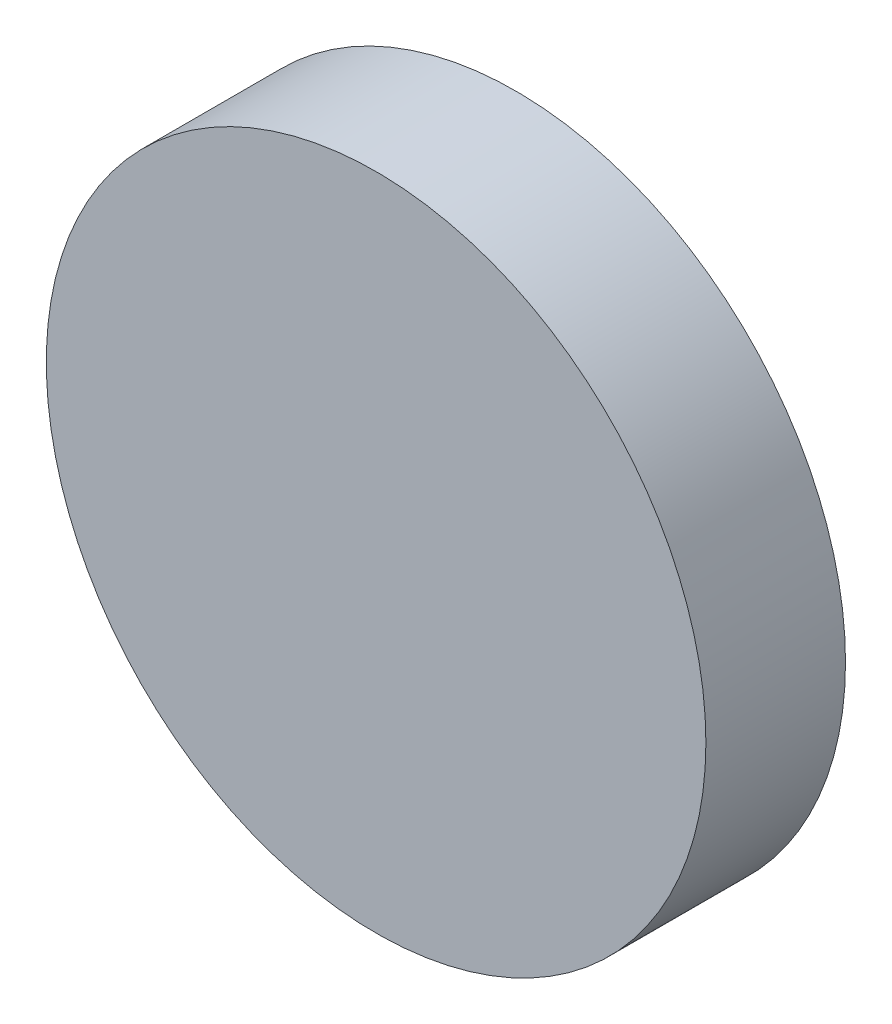
ISO-10303-21;
HEADER;
FILE_DESCRIPTION(('STEP AP214'),'2;1');
FILE_NAME('part.step','',(''),(''),'','','');
FILE_SCHEMA(('AUTOMOTIVE_DESIGN { 1 0 10303 214 1 1 1 1 }'));
ENDSEC;
DATA;
#1=APPLICATION_CONTEXT('core data for automotive mechanical design processes');
#2=APPLICATION_PROTOCOL_DEFINITION('international standard','automotive_design',2000,#1);
#3=PRODUCT_CONTEXT('',#1,'mechanical');
#4=PRODUCT('Part','Part','',(#3));
#5=PRODUCT_RELATED_PRODUCT_CATEGORY('part','',(#4));
#6=PRODUCT_DEFINITION_FORMATION('','',#4);
#7=PRODUCT_DEFINITION_CONTEXT('part definition',#1,'design');
#8=PRODUCT_DEFINITION('design','',#6,#7);
#9=PRODUCT_DEFINITION_SHAPE('','',#8);
#10=(LENGTH_UNIT() NAMED_UNIT(*) SI_UNIT(.MILLI.,.METRE.));
#11=(NAMED_UNIT(*) PLANE_ANGLE_UNIT() SI_UNIT($,.RADIAN.));
#12=(NAMED_UNIT(*) SI_UNIT($,.STERADIAN.) SOLID_ANGLE_UNIT());
#13=UNCERTAINTY_MEASURE_WITH_UNIT(LENGTH_MEASURE(1.E-05),#10,'distance_accuracy_value','');
#14=(GEOMETRIC_REPRESENTATION_CONTEXT(3) GLOBAL_UNCERTAINTY_ASSIGNED_CONTEXT((#13)) GLOBAL_UNIT_ASSIGNED_CONTEXT((#10,
#11,#12)) REPRESENTATION_CONTEXT('',''));
#15=CARTESIAN_POINT('',(0.,0.,0.));
#16=DIRECTION('',(0.,0.,1.));
#17=DIRECTION('',(1.,0.,0.));
#18=AXIS2_PLACEMENT_3D('',#15,#16,#17);
#19=CARTESIAN_POINT('',(0.,0.,3.175));
#20=DIRECTION('',(0.,0.,-1.));
#21=DIRECTION('',(-1.,0.,0.));
#22=AXIS2_PLACEMENT_3D('',#19,#20,#21);
#23=CYLINDRICAL_SURFACE('',#22,7.5);
#24=CARTESIAN_POINT('',(0.,0.,3.175));
#25=DIRECTION('',(0.,0.,1.));
#26=DIRECTION('',(1.,0.,0.));
#27=AXIS2_PLACEMENT_3D('',#24,#25,#26);
#28=CIRCLE('',#27,7.5);
#29=CARTESIAN_POINT('',(7.5,0.,3.175));
#30=VERTEX_POINT('',#29);
#31=EDGE_CURVE('E11',#30,#30,#28,.T.);
#32=ORIENTED_EDGE('',*,*,#31,.F.);
#33=EDGE_LOOP('',(#32));
#34=FACE_BOUND('',#33,.T.);
#35=CARTESIAN_POINT('',(0.,0.,0.));
#36=DIRECTION('',(0.,0.,1.));
#37=DIRECTION('',(1.,0.,0.));
#38=AXIS2_PLACEMENT_3D('',#35,#36,#37);
#39=CIRCLE('',#38,7.5);
#40=CARTESIAN_POINT('',(7.5,0.,0.));
#41=VERTEX_POINT('',#40);
#42=EDGE_CURVE('E34',#41,#41,#39,.T.);
#43=ORIENTED_EDGE('',*,*,#42,.T.);
#44=EDGE_LOOP('',(#43));
#45=FACE_BOUND('',#44,.T.);
#46=ADVANCED_FACE('F31',(#34,#45),#23,.T.);
#47=CARTESIAN_POINT('',(0.,0.,3.175));
#48=DIRECTION('',(0.,0.,1.));
#49=DIRECTION('',(1.,0.,0.));
#50=AXIS2_PLACEMENT_3D('',#47,#48,#49);
#51=PLANE('',#50);
#52=ORIENTED_EDGE('',*,*,#31,.T.);
#53=EDGE_LOOP('',(#52));
#54=FACE_BOUND('',#53,.T.);
#55=ADVANCED_FACE('F48',(#54),#51,.T.);
#56=CARTESIAN_POINT('',(0.,0.,0.));
#57=DIRECTION('',(0.,0.,1.));
#58=DIRECTION('',(1.,0.,0.));
#59=AXIS2_PLACEMENT_3D('',#56,#57,#58);
#60=PLANE('',#59);
#61=ORIENTED_EDGE('',*,*,#42,.F.);
#62=EDGE_LOOP('',(#61));
#63=FACE_BOUND('',#62,.T.);
#64=ADVANCED_FACE('F46',(#63),#60,.F.);
#65=CLOSED_SHELL('',(#46,#55,#64));
#66=MANIFOLD_SOLID_BREP('B2',#65);
#67=ADVANCED_BREP_SHAPE_REPRESENTATION('',(#18,#66),#14);
#68=SHAPE_DEFINITION_REPRESENTATION(#9,#67);
ENDSEC;
END-ISO-10303-21;
